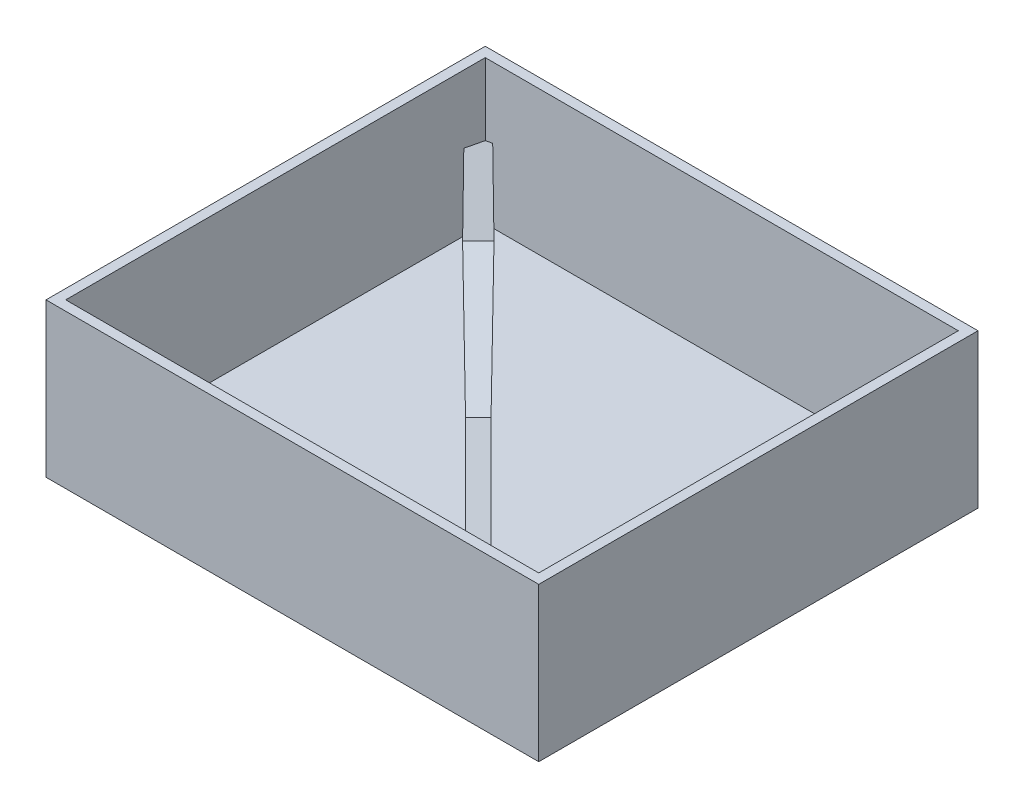
ISO-10303-21;
HEADER;
FILE_DESCRIPTION(('STEP AP214'),'2;1');
FILE_NAME('part.step','',(''),(''),'','','');
FILE_SCHEMA(('AUTOMOTIVE_DESIGN { 1 0 10303 214 1 1 1 1 }'));
ENDSEC;
DATA;
#1=APPLICATION_CONTEXT('core data for automotive mechanical design processes');
#2=APPLICATION_PROTOCOL_DEFINITION('international standard','automotive_design',2000,#1);
#3=PRODUCT_CONTEXT('',#1,'mechanical');
#4=PRODUCT('Part','Part','',(#3));
#5=PRODUCT_RELATED_PRODUCT_CATEGORY('part','',(#4));
#6=PRODUCT_DEFINITION_FORMATION('','',#4);
#7=PRODUCT_DEFINITION_CONTEXT('part definition',#1,'design');
#8=PRODUCT_DEFINITION('design','',#6,#7);
#9=PRODUCT_DEFINITION_SHAPE('','',#8);
#10=(LENGTH_UNIT() NAMED_UNIT(*) SI_UNIT(.MILLI.,.METRE.));
#11=(NAMED_UNIT(*) PLANE_ANGLE_UNIT() SI_UNIT($,.RADIAN.));
#12=(NAMED_UNIT(*) SI_UNIT($,.STERADIAN.) SOLID_ANGLE_UNIT());
#13=UNCERTAINTY_MEASURE_WITH_UNIT(LENGTH_MEASURE(1.E-05),#10,'distance_accuracy_value','');
#14=(GEOMETRIC_REPRESENTATION_CONTEXT(3) GLOBAL_UNCERTAINTY_ASSIGNED_CONTEXT((#13)) GLOBAL_UNIT_ASSIGNED_CONTEXT((#10,
#11,#12)) REPRESENTATION_CONTEXT('',''));
#15=CARTESIAN_POINT('',(0.,0.,0.));
#16=DIRECTION('',(0.,0.,1.));
#17=DIRECTION('',(1.,0.,0.));
#18=AXIS2_PLACEMENT_3D('',#15,#16,#17);
#19=CARTESIAN_POINT('',(0.,2.54,0.));
#20=DIRECTION('',(0.,1.,0.));
#21=DIRECTION('',(0.,0.,1.));
#22=AXIS2_PLACEMENT_3D('',#19,#20,#21);
#23=PLANE('',#22);
#24=DIRECTION('',(-1.,0.,0.));
#25=VECTOR('',#24,1.);
#26=CARTESIAN_POINT('',(-62.4778997860176,2.54,-61.397043942379));
#27=LINE('',#26,#25);
#28=CARTESIAN_POINT('',(62.0602912861796,2.54,-61.397043942379));
#29=VERTEX_POINT('',#28);
#30=CARTESIAN_POINT('',(-58.9369819024458,2.54,-61.397043942379));
#31=VERTEX_POINT('',#30);
#32=EDGE_CURVE('E207',#29,#31,#27,.T.);
#33=ORIENTED_EDGE('',*,*,#32,.T.);
#34=DIRECTION('',(0.703736113740902,0.,0.710461457235262));
#35=VECTOR('',#34,1.);
#36=CARTESIAN_POINT('',(0.948368748941082,2.54,-0.939391336400274));
#37=LINE('',#36,#35);
#38=CARTESIAN_POINT('',(48.2414006024176,2.54,46.8056023787655));
#39=VERTEX_POINT('',#38);
#40=EDGE_CURVE('E244',#31,#39,#37,.T.);
#41=ORIENTED_EDGE('',*,*,#40,.T.);
#42=DIRECTION('',(1.,0.,0.));
#43=VECTOR('',#42,1.);
#44=CARTESIAN_POINT('',(-62.4778997860176,2.54,46.8056023787655));
#45=LINE('',#44,#43);
#46=CARTESIAN_POINT('',(62.0602912861796,2.54,46.8056023787655));
#47=VERTEX_POINT('',#46);
#48=EDGE_CURVE('E186',#39,#47,#45,.T.);
#49=ORIENTED_EDGE('',*,*,#48,.T.);
#50=DIRECTION('',(0.,0.,-1.));
#51=VECTOR('',#50,1.);
#52=CARTESIAN_POINT('',(62.0602912861796,2.54,-63.9370439423789));
#53=LINE('',#52,#51);
#54=EDGE_CURVE('E205',#47,#29,#53,.T.);
#55=ORIENTED_EDGE('',*,*,#54,.T.);
#56=EDGE_LOOP('',(#33,#41,#49,#55));
#57=FACE_BOUND('',#56,.T.);
#58=ADVANCED_FACE('F43',(#57),#23,.T.);
#59=CARTESIAN_POINT('',(-62.4778997860176,39.624,-63.9370439423789));
#60=DIRECTION('',(1.,0.,0.));
#61=DIRECTION('',(0.,0.,-1.));
#62=AXIS2_PLACEMENT_3D('',#59,#60,#61);
#63=PLANE('',#62);
#64=DIRECTION('',(0.,-1.,0.));
#65=VECTOR('',#64,1.);
#66=CARTESIAN_POINT('',(-62.4778997860176,39.624,-63.9370439423789));
#67=LINE('',#66,#65);
#68=CARTESIAN_POINT('',(-62.4778997860176,39.624,-63.9370439423789));
#69=VERTEX_POINT('',#68);
#70=CARTESIAN_POINT('',(-62.4778997860176,0.,-63.9370439423789));
#71=VERTEX_POINT('',#70);
#72=EDGE_CURVE('E227',#69,#71,#67,.T.);
#73=ORIENTED_EDGE('',*,*,#72,.T.);
#74=DIRECTION('',(0.,0.,1.));
#75=VECTOR('',#74,1.);
#76=CARTESIAN_POINT('',(-62.4778997860176,0.,-63.9370439423789));
#77=LINE('',#76,#75);
#78=CARTESIAN_POINT('',(-62.4778997860176,0.,49.3456023787655));
#79=VERTEX_POINT('',#78);
#80=EDGE_CURVE('E194',#71,#79,#77,.T.);
#81=ORIENTED_EDGE('',*,*,#80,.T.);
#82=DIRECTION('',(0.,-1.,0.));
#83=VECTOR('',#82,1.);
#84=CARTESIAN_POINT('',(-62.4778997860176,39.624,49.3456023787655));
#85=LINE('',#84,#83);
#86=CARTESIAN_POINT('',(-62.4778997860176,39.624,49.3456023787655));
#87=VERTEX_POINT('',#86);
#88=EDGE_CURVE('E245',#87,#79,#85,.T.);
#89=ORIENTED_EDGE('',*,*,#88,.F.);
#90=DIRECTION('',(0.,0.,1.));
#91=VECTOR('',#90,1.);
#92=CARTESIAN_POINT('',(-62.4778997860176,39.624,-63.9370439423789));
#93=LINE('',#92,#91);
#94=EDGE_CURVE('E217',#69,#87,#93,.T.);
#95=ORIENTED_EDGE('',*,*,#94,.F.);
#96=EDGE_LOOP('',(#73,#81,#89,#95));
#97=FACE_BOUND('',#96,.T.);
#98=ADVANCED_FACE('F44',(#97),#63,.F.);
#99=CARTESIAN_POINT('',(-62.4778997860176,39.624,49.3456023787655));
#100=DIRECTION('',(0.,0.,-1.));
#101=DIRECTION('',(-1.,0.,0.));
#102=AXIS2_PLACEMENT_3D('',#99,#100,#101);
#103=PLANE('',#102);
#104=DIRECTION('',(1.,0.,0.));
#105=VECTOR('',#104,1.);
#106=CARTESIAN_POINT('',(-62.4778997860176,0.,49.3456023787655));
#107=LINE('',#106,#105);
#108=CARTESIAN_POINT('',(64.6002912861796,0.,49.3456023787655));
#109=VERTEX_POINT('',#108);
#110=EDGE_CURVE('E230',#79,#109,#107,.T.);
#111=ORIENTED_EDGE('',*,*,#110,.T.);
#112=DIRECTION('',(0.,-1.,0.));
#113=VECTOR('',#112,1.);
#114=CARTESIAN_POINT('',(64.6002912861796,39.624,49.3456023787655));
#115=LINE('',#114,#113);
#116=CARTESIAN_POINT('',(64.6002912861796,39.624,49.3456023787655));
#117=VERTEX_POINT('',#116);
#118=EDGE_CURVE('E237',#117,#109,#115,.T.);
#119=ORIENTED_EDGE('',*,*,#118,.F.);
#120=DIRECTION('',(1.,0.,0.));
#121=VECTOR('',#120,1.);
#122=CARTESIAN_POINT('',(-62.4778997860176,39.624,49.3456023787655));
#123=LINE('',#122,#121);
#124=EDGE_CURVE('E220',#87,#117,#123,.T.);
#125=ORIENTED_EDGE('',*,*,#124,.F.);
#126=ORIENTED_EDGE('',*,*,#88,.T.);
#127=EDGE_LOOP('',(#111,#119,#125,#126));
#128=FACE_BOUND('',#127,.T.);
#129=ADVANCED_FACE('F293',(#128),#103,.F.);
#130=CARTESIAN_POINT('',(64.6002912861796,39.624,-63.9370439423789));
#131=DIRECTION('',(-1.,0.,0.));
#132=DIRECTION('',(0.,0.,1.));
#133=AXIS2_PLACEMENT_3D('',#130,#131,#132);
#134=PLANE('',#133);
#135=DIRECTION('',(0.,0.,-1.));
#136=VECTOR('',#135,1.);
#137=CARTESIAN_POINT('',(64.6002912861796,0.,-63.9370439423789));
#138=LINE('',#137,#136);
#139=CARTESIAN_POINT('',(64.6002912861796,0.,-63.9370439423789));
#140=VERTEX_POINT('',#139);
#141=EDGE_CURVE('E233',#109,#140,#138,.T.);
#142=ORIENTED_EDGE('',*,*,#141,.T.);
#143=DIRECTION('',(0.,-1.,0.));
#144=VECTOR('',#143,1.);
#145=CARTESIAN_POINT('',(64.6002912861796,39.624,-63.9370439423789));
#146=LINE('',#145,#144);
#147=CARTESIAN_POINT('',(64.6002912861796,39.624,-63.9370439423789));
#148=VERTEX_POINT('',#147);
#149=EDGE_CURVE('E236',#148,#140,#146,.T.);
#150=ORIENTED_EDGE('',*,*,#149,.F.);
#151=DIRECTION('',(0.,0.,-1.));
#152=VECTOR('',#151,1.);
#153=CARTESIAN_POINT('',(64.6002912861796,39.624,-63.9370439423789));
#154=LINE('',#153,#152);
#155=EDGE_CURVE('E223',#117,#148,#154,.T.);
#156=ORIENTED_EDGE('',*,*,#155,.F.);
#157=ORIENTED_EDGE('',*,*,#118,.T.);
#158=EDGE_LOOP('',(#142,#150,#156,#157));
#159=FACE_BOUND('',#158,.T.);
#160=ADVANCED_FACE('F324',(#159),#134,.F.);
#161=CARTESIAN_POINT('',(-62.4778997860176,39.624,-63.9370439423789));
#162=DIRECTION('',(0.,0.,1.));
#163=DIRECTION('',(1.,0.,0.));
#164=AXIS2_PLACEMENT_3D('',#161,#162,#163);
#165=PLANE('',#164);
#166=DIRECTION('',(-1.,0.,0.));
#167=VECTOR('',#166,1.);
#168=CARTESIAN_POINT('',(-62.4778997860176,0.,-63.9370439423789));
#169=LINE('',#168,#167);
#170=EDGE_CURVE('E221',#140,#71,#169,.T.);
#171=ORIENTED_EDGE('',*,*,#170,.T.);
#172=ORIENTED_EDGE('',*,*,#72,.F.);
#173=DIRECTION('',(-1.,0.,0.));
#174=VECTOR('',#173,1.);
#175=CARTESIAN_POINT('',(-62.4778997860176,39.624,-63.9370439423789));
#176=LINE('',#175,#174);
#177=EDGE_CURVE('E224',#148,#69,#176,.T.);
#178=ORIENTED_EDGE('',*,*,#177,.F.);
#179=ORIENTED_EDGE('',*,*,#149,.T.);
#180=EDGE_LOOP('',(#171,#172,#178,#179));
#181=FACE_BOUND('',#180,.T.);
#182=ADVANCED_FACE('F316',(#181),#165,.F.);
#183=CARTESIAN_POINT('',(0.,39.624,0.));
#184=DIRECTION('',(0.,1.,0.));
#185=DIRECTION('',(0.,0.,1.));
#186=AXIS2_PLACEMENT_3D('',#183,#184,#185);
#187=PLANE('',#186);
#188=DIRECTION('',(0.,0.,1.));
#189=VECTOR('',#188,1.);
#190=CARTESIAN_POINT('',(-59.9378997860176,39.624,-63.9370439423789));
#191=LINE('',#190,#189);
#192=CARTESIAN_POINT('',(-59.9378997860176,39.624,-61.397043942379));
#193=VERTEX_POINT('',#192);
#194=CARTESIAN_POINT('',(-59.9378997860176,39.624,46.8056023787655));
#195=VERTEX_POINT('',#194);
#196=EDGE_CURVE('E208',#193,#195,#191,.T.);
#197=ORIENTED_EDGE('',*,*,#196,.F.);
#198=DIRECTION('',(-1.,0.,0.));
#199=VECTOR('',#198,1.);
#200=CARTESIAN_POINT('',(-62.4778997860176,39.624,-61.397043942379));
#201=LINE('',#200,#199);
#202=CARTESIAN_POINT('',(62.0602912861796,39.624,-61.397043942379));
#203=VERTEX_POINT('',#202);
#204=EDGE_CURVE('E199',#203,#193,#201,.T.);
#205=ORIENTED_EDGE('',*,*,#204,.F.);
#206=DIRECTION('',(0.,0.,-1.));
#207=VECTOR('',#206,1.);
#208=CARTESIAN_POINT('',(62.0602912861796,39.624,-63.9370439423789));
#209=LINE('',#208,#207);
#210=CARTESIAN_POINT('',(62.0602912861796,39.624,46.8056023787655));
#211=VERTEX_POINT('',#210);
#212=EDGE_CURVE('E211',#211,#203,#209,.T.);
#213=ORIENTED_EDGE('',*,*,#212,.F.);
#214=DIRECTION('',(1.,0.,0.));
#215=VECTOR('',#214,1.);
#216=CARTESIAN_POINT('',(-62.4778997860176,39.624,46.8056023787655));
#217=LINE('',#216,#215);
#218=EDGE_CURVE('E215',#195,#211,#217,.T.);
#219=ORIENTED_EDGE('',*,*,#218,.F.);
#220=EDGE_LOOP('',(#197,#205,#213,#219));
#221=FACE_BOUND('',#220,.T.);
#222=ORIENTED_EDGE('',*,*,#94,.T.);
#223=ORIENTED_EDGE('',*,*,#124,.T.);
#224=ORIENTED_EDGE('',*,*,#155,.T.);
#225=ORIENTED_EDGE('',*,*,#177,.T.);
#226=EDGE_LOOP('',(#222,#223,#224,#225));
#227=FACE_BOUND('',#226,.T.);
#228=ADVANCED_FACE('F259',(#221,#227),#187,.T.);
#229=CARTESIAN_POINT('',(0.,0.,0.));
#230=DIRECTION('',(0.,1.,0.));
#231=DIRECTION('',(0.,0.,1.));
#232=AXIS2_PLACEMENT_3D('',#229,#230,#231);
#233=PLANE('',#232);
#234=ORIENTED_EDGE('',*,*,#110,.F.);
#235=ORIENTED_EDGE('',*,*,#80,.F.);
#236=ORIENTED_EDGE('',*,*,#170,.F.);
#237=ORIENTED_EDGE('',*,*,#141,.F.);
#238=EDGE_LOOP('',(#234,#235,#236,#237));
#239=FACE_BOUND('',#238,.T.);
#240=ADVANCED_FACE('F307',(#239),#233,.F.);
#241=CARTESIAN_POINT('',(-59.9378997860176,39.624,-63.9370439423789));
#242=DIRECTION('',(1.,0.,0.));
#243=DIRECTION('',(0.,0.,-1.));
#244=AXIS2_PLACEMENT_3D('',#241,#242,#243);
#245=PLANE('',#244);
#246=DIRECTION('',(0.,-0.189206076258095,-0.981937401623452));
#247=VECTOR('',#246,1.);
#248=CARTESIAN_POINT('',(-59.9378997860176,21.2739437474469,-60.4012359194636));
#249=LINE('',#248,#247);
#250=CARTESIAN_POINT('',(-59.9378997860176,21.0820649897881,-61.397043942379));
#251=VERTEX_POINT('',#250);
#252=CARTESIAN_POINT('',(-59.9378997860176,22.1477745226584,-55.8662487888209));
#253=VERTEX_POINT('',#252);
#254=EDGE_CURVE('E152',#251,#253,#249,.F.);
#255=ORIENTED_EDGE('',*,*,#254,.F.);
#256=DIRECTION('',(0.,-1.,0.));
#257=VECTOR('',#256,1.);
#258=CARTESIAN_POINT('',(-59.9378997860176,39.624,-61.397043942379));
#259=LINE('',#258,#257);
#260=EDGE_CURVE('E193',#193,#251,#259,.T.);
#261=ORIENTED_EDGE('',*,*,#260,.F.);
#262=ORIENTED_EDGE('',*,*,#196,.T.);
#263=DIRECTION('',(0.,-1.,0.));
#264=VECTOR('',#263,1.);
#265=CARTESIAN_POINT('',(-59.9378997860176,39.624,46.8056023787655));
#266=LINE('',#265,#264);
#267=CARTESIAN_POINT('',(-59.9378997860176,2.54,46.8056023787655));
#268=VERTEX_POINT('',#267);
#269=EDGE_CURVE('E188',#195,#268,#266,.T.);
#270=ORIENTED_EDGE('',*,*,#269,.T.);
#271=DIRECTION('',(0.,0.,1.));
#272=VECTOR('',#271,1.);
#273=CARTESIAN_POINT('',(-59.9378997860176,2.54,-63.9370439423789));
#274=LINE('',#273,#272);
#275=CARTESIAN_POINT('',(-59.9378997860176,2.54,-56.8210253228486));
#276=VERTEX_POINT('',#275);
#277=EDGE_CURVE('E190',#276,#268,#274,.T.);
#278=ORIENTED_EDGE('',*,*,#277,.F.);
#279=DIRECTION('',(0.,-0.998816562311674,-0.0486361475847926));
#280=VECTOR('',#279,1.);
#281=CARTESIAN_POINT('',(-59.9378997860176,39.1905925815297,-55.0363696642161));
#282=LINE('',#281,#280);
#283=EDGE_CURVE('E183',#253,#276,#282,.T.);
#284=ORIENTED_EDGE('',*,*,#283,.F.);
#285=EDGE_LOOP('',(#255,#261,#262,#270,#278,#284));
#286=FACE_BOUND('',#285,.T.);
#287=ADVANCED_FACE('F252',(#286),#245,.T.);
#288=CARTESIAN_POINT('',(-62.4778997860176,39.624,46.8056023787655));
#289=DIRECTION('',(0.,0.,-1.));
#290=DIRECTION('',(-1.,0.,0.));
#291=AXIS2_PLACEMENT_3D('',#288,#289,#290);
#292=PLANE('',#291);
#293=DIRECTION('',(-0.049099829862606,0.998793875986163,0.));
#294=VECTOR('',#293,1.);
#295=CARTESIAN_POINT('',(42.6020937248559,44.789640206047,46.8056023787655));
#296=LINE('',#295,#294);
#297=CARTESIAN_POINT('',(44.6790489362853,2.54,46.8056023787655));
#298=VERTEX_POINT('',#297);
#299=CARTESIAN_POINT('',(43.1796165450702,33.0416105756728,46.8056023787655));
#300=VERTEX_POINT('',#299);
#301=EDGE_CURVE('E185',#298,#300,#296,.T.);
#302=ORIENTED_EDGE('',*,*,#301,.F.);
#303=EDGE_CURVE('E198',#268,#298,#45,.T.);
#304=ORIENTED_EDGE('',*,*,#303,.F.);
#305=ORIENTED_EDGE('',*,*,#269,.F.);
#306=ORIENTED_EDGE('',*,*,#218,.T.);
#307=DIRECTION('',(0.,-1.,0.));
#308=VECTOR('',#307,1.);
#309=CARTESIAN_POINT('',(62.0602912861796,39.624,46.8056023787655));
#310=LINE('',#309,#308);
#311=EDGE_CURVE('E191',#211,#47,#310,.T.);
#312=ORIENTED_EDGE('',*,*,#311,.T.);
#313=ORIENTED_EDGE('',*,*,#48,.F.);
#314=DIRECTION('',(0.0486361475847926,0.998816562311674,0.));
#315=VECTOR('',#314,1.);
#316=CARTESIAN_POINT('',(49.7809853034525,34.1576912613069,46.8056023787655));
#317=LINE('',#316,#315);
#318=CARTESIAN_POINT('',(49.7577740767559,33.6810137527581,46.8056023787655));
#319=VERTEX_POINT('',#318);
#320=EDGE_CURVE('E59',#39,#319,#317,.T.);
#321=ORIENTED_EDGE('',*,*,#320,.T.);
#322=DIRECTION('',(-0.995309200473239,-0.0967450022136603,0.));
#323=VECTOR('',#322,1.);
#324=CARTESIAN_POINT('',(-60.855162060558,22.9293310129866,46.8056023787655));
#325=LINE('',#324,#323);
#326=EDGE_CURVE('E11',#300,#319,#325,.F.);
#327=ORIENTED_EDGE('',*,*,#326,.F.);
#328=EDGE_LOOP('',(#302,#304,#305,#306,#312,#313,#321,#327));
#329=FACE_BOUND('',#328,.T.);
#330=ADVANCED_FACE('F265',(#329),#292,.T.);
#331=CARTESIAN_POINT('',(62.0602912861796,39.624,-63.9370439423789));
#332=DIRECTION('',(-1.,0.,0.));
#333=DIRECTION('',(0.,0.,1.));
#334=AXIS2_PLACEMENT_3D('',#331,#332,#333);
#335=PLANE('',#334);
#336=ORIENTED_EDGE('',*,*,#54,.F.);
#337=ORIENTED_EDGE('',*,*,#311,.F.);
#338=ORIENTED_EDGE('',*,*,#212,.T.);
#339=DIRECTION('',(0.,-1.,0.));
#340=VECTOR('',#339,1.);
#341=CARTESIAN_POINT('',(62.0602912861796,39.624,-61.397043942379));
#342=LINE('',#341,#340);
#343=EDGE_CURVE('E66',#203,#29,#342,.T.);
#344=ORIENTED_EDGE('',*,*,#343,.T.);
#345=EDGE_LOOP('',(#336,#337,#338,#344));
#346=FACE_BOUND('',#345,.T.);
#347=ADVANCED_FACE('F301',(#346),#335,.T.);
#348=CARTESIAN_POINT('',(-62.4778997860176,39.624,-61.397043942379));
#349=DIRECTION('',(0.,0.,1.));
#350=DIRECTION('',(1.,0.,0.));
#351=AXIS2_PLACEMENT_3D('',#348,#349,#350);
#352=PLANE('',#351);
#353=DIRECTION('',(0.981937401623452,0.189206076258095,0.));
#354=VECTOR('',#353,1.);
#355=CARTESIAN_POINT('',(-58.9420917631022,21.2739437474469,-61.397043942379));
#356=LINE('',#355,#354);
#357=CARTESIAN_POINT('',(-58.0160669356714,21.4523762257556,-61.397043942379));
#358=VERTEX_POINT('',#357);
#359=EDGE_CURVE('E51',#358,#251,#356,.F.);
#360=ORIENTED_EDGE('',*,*,#359,.F.);
#361=DIRECTION('',(-0.0486361475847926,-0.998816562311674,0.));
#362=VECTOR('',#361,1.);
#363=CARTESIAN_POINT('',(-57.1438694329295,39.3642659334421,-61.397043942379));
#364=LINE('',#363,#362);
#365=EDGE_CURVE('E178',#358,#31,#364,.T.);
#366=ORIENTED_EDGE('',*,*,#365,.T.);
#367=ORIENTED_EDGE('',*,*,#32,.F.);
#368=ORIENTED_EDGE('',*,*,#343,.F.);
#369=ORIENTED_EDGE('',*,*,#204,.T.);
#370=ORIENTED_EDGE('',*,*,#260,.T.);
#371=EDGE_LOOP('',(#360,#366,#367,#368,#369,#370));
#372=FACE_BOUND('',#371,.T.);
#373=ADVANCED_FACE('F251',(#372),#352,.T.);
#374=DIRECTION('',(0.710461457235262,0.,0.703736113740902));
#375=VECTOR('',#374,1.);
#376=CARTESIAN_POINT('',(-1.27468862948822,2.54,1.28687035316884));
#377=LINE('',#376,#375);
#378=EDGE_CURVE('E250',#276,#298,#377,.T.);
#379=ORIENTED_EDGE('',*,*,#378,.F.);
#380=ORIENTED_EDGE('',*,*,#277,.T.);
#381=ORIENTED_EDGE('',*,*,#303,.T.);
#382=EDGE_LOOP('',(#379,#380,#381));
#383=FACE_BOUND('',#382,.T.);
#384=ADVANCED_FACE('F269',(#383),#23,.T.);
#385=CARTESIAN_POINT('',(6.19267906962794,25.357,4.73353491326659));
#386=DIRECTION('',(0.0962954087319371,-0.990683798451503,0.0962954087319371));
#387=DIRECTION('',(0.700519231896705,0.136182273022966,0.700519231896705));
#388=AXIS2_PLACEMENT_3D('',#385,#386,#387);
#389=PLANE('',#388);
#390=DIRECTION('',(-0.700519231896705,-0.136182273022966,-0.700519231896705));
#391=VECTOR('',#390,1.);
#392=CARTESIAN_POINT('',(3.6501140745996,25.357,7.27609990829494));
#393=LINE('',#392,#391);
#394=CARTESIAN_POINT('',(3.6501140745996,25.357,7.27609990829494));
#395=VERTEX_POINT('',#394);
#396=EDGE_CURVE('E166',#395,#300,#393,.F.);
#397=ORIENTED_EDGE('',*,*,#396,.T.);
#398=ORIENTED_EDGE('',*,*,#326,.T.);
#399=DIRECTION('',(0.700519231896705,0.136182273022966,0.700519231896705));
#400=VECTOR('',#399,1.);
#401=CARTESIAN_POINT('',(8.13303513579615,25.589085216236,5.18086343780577));
#402=LINE('',#401,#400);
#403=CARTESIAN_POINT('',(6.93919284044245,25.357,3.98702114245208));
#404=VERTEX_POINT('',#403);
#405=EDGE_CURVE('E172',#404,#319,#402,.T.);
#406=ORIENTED_EDGE('',*,*,#405,.F.);
#407=DIRECTION('',(-0.707106781186547,0.,0.707106781186548));
#408=VECTOR('',#407,1.);
#409=CARTESIAN_POINT('',(6.19267906962794,25.357,4.73353491326659));
#410=LINE('',#409,#408);
#411=EDGE_CURVE('E161',#404,#395,#410,.T.);
#412=ORIENTED_EDGE('',*,*,#411,.T.);
#413=EDGE_LOOP('',(#397,#398,#406,#412));
#414=FACE_BOUND('',#413,.T.);
#415=ADVANCED_FACE('F275',(#414),#389,.F.);
#416=CARTESIAN_POINT('',(-23.4746930418348,35.134,-24.9338371981962));
#417=DIRECTION('',(-0.160477384938449,-0.973906575522844,-0.160477384938449));
#418=DIRECTION('',(0.688655943794372,-0.226949294234123,0.688655943794372));
#419=AXIS2_PLACEMENT_3D('',#416,#417,#418);
#420=PLANE('',#419);
#421=ORIENTED_EDGE('',*,*,#411,.F.);
#422=DIRECTION('',(0.679776232458364,-0.22693161433286,0.697428359188953));
#423=VECTOR('',#422,1.);
#424=CARTESIAN_POINT('',(15.3757135360253,22.5406125339695,12.6426176535354));
#425=LINE('',#424,#423);
#426=CARTESIAN_POINT('',(-22.3479218891823,35.134,-26.0606083508487));
#427=VERTEX_POINT('',#426);
#428=EDGE_CURVE('E162',#427,#404,#425,.T.);
#429=ORIENTED_EDGE('',*,*,#428,.F.);
#430=DIRECTION('',(-0.707106781186547,0.,0.707106781186548));
#431=VECTOR('',#430,1.);
#432=CARTESIAN_POINT('',(-23.4746930418348,35.134,-24.9338371981962));
#433=LINE('',#432,#431);
#434=CARTESIAN_POINT('',(-26.3975154187012,35.134,-22.0110148213298));
#435=VERTEX_POINT('',#434);
#436=EDGE_CURVE('E146',#427,#435,#433,.T.);
#437=ORIENTED_EDGE('',*,*,#436,.T.);
#438=DIRECTION('',(-0.697428359188953,0.22693161433286,-0.679776232458364));
#439=VECTOR('',#438,1.);
#440=CARTESIAN_POINT('',(-26.3615322783117,35.1222916832535,-21.9759424253143));
#441=LINE('',#440,#439);
#442=EDGE_CURVE('E156',#435,#395,#441,.F.);
#443=ORIENTED_EDGE('',*,*,#442,.T.);
#444=EDGE_LOOP('',(#421,#429,#437,#443));
#445=FACE_BOUND('',#444,.T.);
#446=ADVANCED_FACE('F159',(#445),#420,.F.);
#447=CARTESIAN_POINT('',(-59.9380684272816,21.082,-61.3972125836429));
#448=DIRECTION('',(0.185907687388523,-0.96481949790606,0.185907687388523));
#449=DIRECTION('',(0.682230409590376,0.262913172854267,0.682230409590375));
#450=AXIS2_PLACEMENT_3D('',#447,#448,#449);
#451=PLANE('',#450);
#452=ORIENTED_EDGE('',*,*,#359,.T.);
#453=ORIENTED_EDGE('',*,*,#254,.T.);
#454=DIRECTION('',(-0.679036361626848,-0.26291050224197,-0.685410597670803));
#455=VECTOR('',#454,1.);
#456=CARTESIAN_POINT('',(-62.7024598656856,21.0773872501974,-58.6567602895046));
#457=LINE('',#456,#455);
#458=EDGE_CURVE('E143',#253,#435,#457,.F.);
#459=ORIENTED_EDGE('',*,*,#458,.T.);
#460=ORIENTED_EDGE('',*,*,#436,.F.);
#461=DIRECTION('',(0.685410597670804,0.26291050224197,0.679036361626847));
#462=VECTOR('',#461,1.);
#463=CARTESIAN_POINT('',(2.11421089920389,44.5172100629312,-1.82597045247681));
#464=LINE('',#463,#462);
#465=EDGE_CURVE('E167',#358,#427,#464,.T.);
#466=ORIENTED_EDGE('',*,*,#465,.F.);
#467=EDGE_LOOP('',(#452,#453,#459,#460,#466));
#468=FACE_BOUND('',#467,.T.);
#469=ADVANCED_FACE('F150',(#468),#451,.F.);
#470=CARTESIAN_POINT('',(8.50168726547893,-4.36141478376402,10.6346455575452));
#471=DIRECTION('',(-0.703315369541328,-0.0345743659572794,0.710036692140341));
#472=DIRECTION('',(0.710461457235262,0.,0.703736113740902));
#473=AXIS2_PLACEMENT_3D('',#470,#471,#472);
#474=PLANE('',#473);
#475=ORIENTED_EDGE('',*,*,#458,.F.);
#476=ORIENTED_EDGE('',*,*,#283,.T.);
#477=ORIENTED_EDGE('',*,*,#378,.T.);
#478=ORIENTED_EDGE('',*,*,#301,.T.);
#479=ORIENTED_EDGE('',*,*,#396,.F.);
#480=ORIENTED_EDGE('',*,*,#442,.F.);
#481=EDGE_LOOP('',(#475,#476,#477,#478,#479,#480));
#482=FACE_BOUND('',#481,.T.);
#483=ADVANCED_FACE('F168',(#482),#474,.T.);
#484=CARTESIAN_POINT('',(10.2977384896928,-4.36141478376402,8.83859433333141));
#485=DIRECTION('',(-0.710036692140341,0.0345743659572794,0.703315369541328));
#486=DIRECTION('',(0.703736113740902,0.,0.710461457235262));
#487=AXIS2_PLACEMENT_3D('',#484,#485,#486);
#488=PLANE('',#487);
#489=ORIENTED_EDGE('',*,*,#320,.F.);
#490=ORIENTED_EDGE('',*,*,#40,.F.);
#491=ORIENTED_EDGE('',*,*,#365,.F.);
#492=ORIENTED_EDGE('',*,*,#465,.T.);
#493=ORIENTED_EDGE('',*,*,#428,.T.);
#494=ORIENTED_EDGE('',*,*,#405,.T.);
#495=EDGE_LOOP('',(#489,#490,#491,#492,#493,#494));
#496=FACE_BOUND('',#495,.T.);
#497=ADVANCED_FACE('F280',(#496),#488,.F.);
#498=CLOSED_SHELL('',(#58,#98,#129,#160,#182,#228,#240,#287,#330,#347,#373,#384,#415,#446,#469,
#483,#497));
#499=MANIFOLD_SOLID_BREP('B2',#498);
#500=ADVANCED_BREP_SHAPE_REPRESENTATION('',(#18,#499),#14);
#501=SHAPE_DEFINITION_REPRESENTATION(#9,#500);
ENDSEC;
END-ISO-10303-21;
